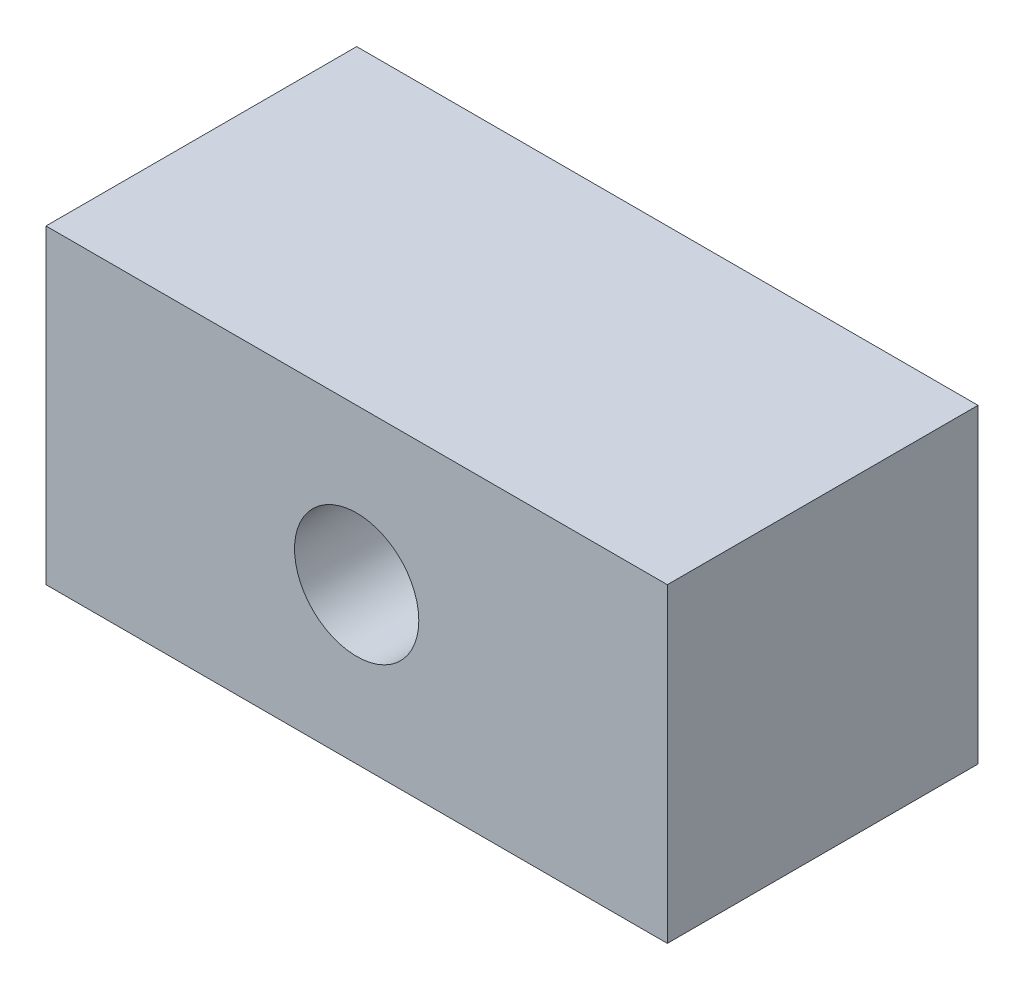
ISO-10303-21;
HEADER;
FILE_DESCRIPTION(('STEP AP214'),'2;1');
FILE_NAME('part.step','',(''),(''),'','','');
FILE_SCHEMA(('AUTOMOTIVE_DESIGN { 1 0 10303 214 1 1 1 1 }'));
ENDSEC;
DATA;
#1=APPLICATION_CONTEXT('core data for automotive mechanical design processes');
#2=APPLICATION_PROTOCOL_DEFINITION('international standard','automotive_design',2000,#1);
#3=PRODUCT_CONTEXT('',#1,'mechanical');
#4=PRODUCT('Part','Part','',(#3));
#5=PRODUCT_RELATED_PRODUCT_CATEGORY('part','',(#4));
#6=PRODUCT_DEFINITION_FORMATION('','',#4);
#7=PRODUCT_DEFINITION_CONTEXT('part definition',#1,'design');
#8=PRODUCT_DEFINITION('design','',#6,#7);
#9=PRODUCT_DEFINITION_SHAPE('','',#8);
#10=(LENGTH_UNIT() NAMED_UNIT(*) SI_UNIT(.MILLI.,.METRE.));
#11=(NAMED_UNIT(*) PLANE_ANGLE_UNIT() SI_UNIT($,.RADIAN.));
#12=(NAMED_UNIT(*) SI_UNIT($,.STERADIAN.) SOLID_ANGLE_UNIT());
#13=UNCERTAINTY_MEASURE_WITH_UNIT(LENGTH_MEASURE(1.E-05),#10,'distance_accuracy_value','');
#14=(GEOMETRIC_REPRESENTATION_CONTEXT(3) GLOBAL_UNCERTAINTY_ASSIGNED_CONTEXT((#13)) GLOBAL_UNIT_ASSIGNED_CONTEXT((#10,
#11,#12)) REPRESENTATION_CONTEXT('',''));
#15=CARTESIAN_POINT('',(0.,0.,0.));
#16=DIRECTION('',(0.,0.,1.));
#17=DIRECTION('',(1.,0.,0.));
#18=AXIS2_PLACEMENT_3D('',#15,#16,#17);
#19=CARTESIAN_POINT('',(0.,20.,10.));
#20=DIRECTION('',(1.,0.,0.));
#21=DIRECTION('',(0.,0.,-1.));
#22=AXIS2_PLACEMENT_3D('',#19,#20,#21);
#23=PLANE('',#22);
#24=DIRECTION('',(0.,-1.,0.));
#25=VECTOR('',#24,1.);
#26=CARTESIAN_POINT('',(0.,20.,-10.));
#27=LINE('',#26,#25);
#28=CARTESIAN_POINT('',(0.,20.,-10.));
#29=VERTEX_POINT('',#28);
#30=CARTESIAN_POINT('',(0.,0.,-10.));
#31=VERTEX_POINT('',#30);
#32=EDGE_CURVE('E104',#29,#31,#27,.T.);
#33=ORIENTED_EDGE('',*,*,#32,.T.);
#34=DIRECTION('',(0.,0.,-1.));
#35=VECTOR('',#34,1.);
#36=CARTESIAN_POINT('',(0.,0.,10.));
#37=LINE('',#36,#35);
#38=CARTESIAN_POINT('',(0.,0.,10.));
#39=VERTEX_POINT('',#38);
#40=EDGE_CURVE('E11',#39,#31,#37,.T.);
#41=ORIENTED_EDGE('',*,*,#40,.F.);
#42=DIRECTION('',(0.,-1.,0.));
#43=VECTOR('',#42,1.);
#44=CARTESIAN_POINT('',(0.,20.,10.));
#45=LINE('',#44,#43);
#46=CARTESIAN_POINT('',(0.,20.,10.));
#47=VERTEX_POINT('',#46);
#48=EDGE_CURVE('E92',#47,#39,#45,.T.);
#49=ORIENTED_EDGE('',*,*,#48,.F.);
#50=DIRECTION('',(0.,0.,-1.));
#51=VECTOR('',#50,1.);
#52=CARTESIAN_POINT('',(0.,20.,10.));
#53=LINE('',#52,#51);
#54=EDGE_CURVE('E100',#47,#29,#53,.T.);
#55=ORIENTED_EDGE('',*,*,#54,.T.);
#56=EDGE_LOOP('',(#33,#41,#49,#55));
#57=FACE_BOUND('',#56,.T.);
#58=ADVANCED_FACE('F41',(#57),#23,.F.);
#59=CARTESIAN_POINT('',(0.,0.,10.));
#60=DIRECTION('',(0.,1.,0.));
#61=DIRECTION('',(0.,0.,1.));
#62=AXIS2_PLACEMENT_3D('',#59,#60,#61);
#63=PLANE('',#62);
#64=DIRECTION('',(1.,0.,0.));
#65=VECTOR('',#64,1.);
#66=CARTESIAN_POINT('',(0.,0.,-10.));
#67=LINE('',#66,#65);
#68=CARTESIAN_POINT('',(40.,0.,-10.));
#69=VERTEX_POINT('',#68);
#70=EDGE_CURVE('E96',#31,#69,#67,.T.);
#71=ORIENTED_EDGE('',*,*,#70,.T.);
#72=DIRECTION('',(0.,0.,-1.));
#73=VECTOR('',#72,1.);
#74=CARTESIAN_POINT('',(40.,0.,10.));
#75=LINE('',#74,#73);
#76=CARTESIAN_POINT('',(40.,0.,10.));
#77=VERTEX_POINT('',#76);
#78=EDGE_CURVE('E49',#77,#69,#75,.T.);
#79=ORIENTED_EDGE('',*,*,#78,.F.);
#80=DIRECTION('',(1.,0.,0.));
#81=VECTOR('',#80,1.);
#82=CARTESIAN_POINT('',(0.,0.,10.));
#83=LINE('',#82,#81);
#84=EDGE_CURVE('E87',#39,#77,#83,.T.);
#85=ORIENTED_EDGE('',*,*,#84,.F.);
#86=ORIENTED_EDGE('',*,*,#40,.T.);
#87=EDGE_LOOP('',(#71,#79,#85,#86));
#88=FACE_BOUND('',#87,.T.);
#89=ADVANCED_FACE('F95',(#88),#63,.F.);
#90=CARTESIAN_POINT('',(40.,0.,10.));
#91=DIRECTION('',(-1.,0.,0.));
#92=DIRECTION('',(0.,0.,1.));
#93=AXIS2_PLACEMENT_3D('',#90,#91,#92);
#94=PLANE('',#93);
#95=DIRECTION('',(0.,1.,0.));
#96=VECTOR('',#95,1.);
#97=CARTESIAN_POINT('',(40.,0.,-10.));
#98=LINE('',#97,#96);
#99=CARTESIAN_POINT('',(40.,20.,-10.));
#100=VERTEX_POINT('',#99);
#101=EDGE_CURVE('E74',#69,#100,#98,.T.);
#102=ORIENTED_EDGE('',*,*,#101,.T.);
#103=DIRECTION('',(0.,0.,-1.));
#104=VECTOR('',#103,1.);
#105=CARTESIAN_POINT('',(40.,20.,10.));
#106=LINE('',#105,#104);
#107=CARTESIAN_POINT('',(40.,20.,10.));
#108=VERTEX_POINT('',#107);
#109=EDGE_CURVE('E97',#108,#100,#106,.T.);
#110=ORIENTED_EDGE('',*,*,#109,.F.);
#111=DIRECTION('',(0.,1.,0.));
#112=VECTOR('',#111,1.);
#113=CARTESIAN_POINT('',(40.,0.,10.));
#114=LINE('',#113,#112);
#115=EDGE_CURVE('E90',#77,#108,#114,.T.);
#116=ORIENTED_EDGE('',*,*,#115,.F.);
#117=ORIENTED_EDGE('',*,*,#78,.T.);
#118=EDGE_LOOP('',(#102,#110,#116,#117));
#119=FACE_BOUND('',#118,.T.);
#120=ADVANCED_FACE('F98',(#119),#94,.F.);
#121=CARTESIAN_POINT('',(40.,20.,10.));
#122=DIRECTION('',(0.,-1.,0.));
#123=DIRECTION('',(0.,0.,-1.));
#124=AXIS2_PLACEMENT_3D('',#121,#122,#123);
#125=PLANE('',#124);
#126=DIRECTION('',(-1.,0.,0.));
#127=VECTOR('',#126,1.);
#128=CARTESIAN_POINT('',(40.,20.,-10.));
#129=LINE('',#128,#127);
#130=EDGE_CURVE('E80',#100,#29,#129,.T.);
#131=ORIENTED_EDGE('',*,*,#130,.T.);
#132=ORIENTED_EDGE('',*,*,#54,.F.);
#133=DIRECTION('',(-1.,0.,0.));
#134=VECTOR('',#133,1.);
#135=CARTESIAN_POINT('',(40.,20.,10.));
#136=LINE('',#135,#134);
#137=EDGE_CURVE('E57',#108,#47,#136,.T.);
#138=ORIENTED_EDGE('',*,*,#137,.F.);
#139=ORIENTED_EDGE('',*,*,#109,.T.);
#140=EDGE_LOOP('',(#131,#132,#138,#139));
#141=FACE_BOUND('',#140,.T.);
#142=ADVANCED_FACE('F112',(#141),#125,.F.);
#143=CARTESIAN_POINT('',(0.,0.,10.));
#144=DIRECTION('',(0.,0.,1.));
#145=DIRECTION('',(1.,0.,0.));
#146=AXIS2_PLACEMENT_3D('',#143,#144,#145);
#147=PLANE('',#146);
#148=CARTESIAN_POINT('',(20.,10.,10.));
#149=DIRECTION('',(0.,0.,1.));
#150=DIRECTION('',(1.,0.,0.));
#151=AXIS2_PLACEMENT_3D('',#148,#149,#150);
#152=CIRCLE('',#151,4.);
#153=CARTESIAN_POINT('',(24.,10.,10.));
#154=VERTEX_POINT('',#153);
#155=EDGE_CURVE('E120',#154,#154,#152,.T.);
#156=ORIENTED_EDGE('',*,*,#155,.F.);
#157=EDGE_LOOP('',(#156));
#158=FACE_BOUND('',#157,.T.);
#159=ORIENTED_EDGE('',*,*,#48,.T.);
#160=ORIENTED_EDGE('',*,*,#84,.T.);
#161=ORIENTED_EDGE('',*,*,#115,.T.);
#162=ORIENTED_EDGE('',*,*,#137,.T.);
#163=EDGE_LOOP('',(#159,#160,#161,#162));
#164=FACE_BOUND('',#163,.T.);
#165=ADVANCED_FACE('F88',(#158,#164),#147,.T.);
#166=CARTESIAN_POINT('',(0.,0.,-10.));
#167=DIRECTION('',(0.,0.,1.));
#168=DIRECTION('',(1.,0.,0.));
#169=AXIS2_PLACEMENT_3D('',#166,#167,#168);
#170=PLANE('',#169);
#171=CARTESIAN_POINT('',(20.,10.,-10.));
#172=DIRECTION('',(0.,0.,1.));
#173=DIRECTION('',(1.,0.,0.));
#174=AXIS2_PLACEMENT_3D('',#171,#172,#173);
#175=CIRCLE('',#174,4.);
#176=CARTESIAN_POINT('',(24.,10.,-10.));
#177=VERTEX_POINT('',#176);
#178=EDGE_CURVE('E107',#177,#177,#175,.T.);
#179=ORIENTED_EDGE('',*,*,#178,.T.);
#180=EDGE_LOOP('',(#179));
#181=FACE_BOUND('',#180,.T.);
#182=ORIENTED_EDGE('',*,*,#32,.F.);
#183=ORIENTED_EDGE('',*,*,#130,.F.);
#184=ORIENTED_EDGE('',*,*,#101,.F.);
#185=ORIENTED_EDGE('',*,*,#70,.F.);
#186=EDGE_LOOP('',(#182,#183,#184,#185));
#187=FACE_BOUND('',#186,.T.);
#188=ADVANCED_FACE('F115',(#181,#187),#170,.F.);
#189=CARTESIAN_POINT('',(20.,10.,-10.));
#190=DIRECTION('',(0.,0.,1.));
#191=DIRECTION('',(1.,0.,0.));
#192=AXIS2_PLACEMENT_3D('',#189,#190,#191);
#193=CYLINDRICAL_SURFACE('',#192,4.);
#194=ORIENTED_EDGE('',*,*,#178,.F.);
#195=EDGE_LOOP('',(#194));
#196=FACE_BOUND('',#195,.T.);
#197=ORIENTED_EDGE('',*,*,#155,.T.);
#198=EDGE_LOOP('',(#197));
#199=FACE_BOUND('',#198,.T.);
#200=ADVANCED_FACE('F124',(#196,#199),#193,.F.);
#201=CLOSED_SHELL('',(#58,#89,#120,#142,#165,#188,#200));
#202=MANIFOLD_SOLID_BREP('B2',#201);
#203=ADVANCED_BREP_SHAPE_REPRESENTATION('',(#18,#202),#14);
#204=SHAPE_DEFINITION_REPRESENTATION(#9,#203);
ENDSEC;
END-ISO-10303-21;
